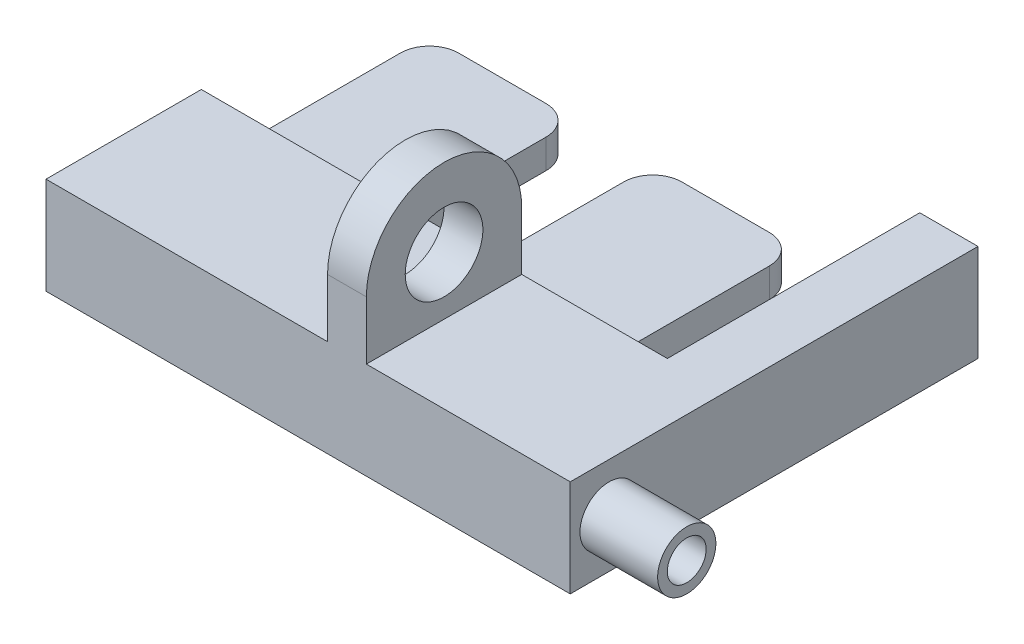
ISO-10303-21;
HEADER;
FILE_DESCRIPTION(('STEP AP214'),'2;1');
FILE_NAME('part.step','',(''),(''),'','','');
FILE_SCHEMA(('AUTOMOTIVE_DESIGN { 1 0 10303 214 1 1 1 1 }'));
ENDSEC;
DATA;
#1=APPLICATION_CONTEXT('core data for automotive mechanical design processes');
#2=APPLICATION_PROTOCOL_DEFINITION('international standard','automotive_design',2000,#1);
#3=PRODUCT_CONTEXT('',#1,'mechanical');
#4=PRODUCT('Part','Part','',(#3));
#5=PRODUCT_RELATED_PRODUCT_CATEGORY('part','',(#4));
#6=PRODUCT_DEFINITION_FORMATION('','',#4);
#7=PRODUCT_DEFINITION_CONTEXT('part definition',#1,'design');
#8=PRODUCT_DEFINITION('design','',#6,#7);
#9=PRODUCT_DEFINITION_SHAPE('','',#8);
#10=(LENGTH_UNIT() NAMED_UNIT(*) SI_UNIT(.MILLI.,.METRE.));
#11=(NAMED_UNIT(*) PLANE_ANGLE_UNIT() SI_UNIT($,.RADIAN.));
#12=(NAMED_UNIT(*) SI_UNIT($,.STERADIAN.) SOLID_ANGLE_UNIT());
#13=UNCERTAINTY_MEASURE_WITH_UNIT(LENGTH_MEASURE(1.E-05),#10,'distance_accuracy_value','');
#14=(GEOMETRIC_REPRESENTATION_CONTEXT(3) GLOBAL_UNCERTAINTY_ASSIGNED_CONTEXT((#13)) GLOBAL_UNIT_ASSIGNED_CONTEXT((#10,
#11,#12)) REPRESENTATION_CONTEXT('',''));
#15=CARTESIAN_POINT('',(0.,0.,0.));
#16=DIRECTION('',(0.,0.,1.));
#17=DIRECTION('',(1.,0.,0.));
#18=AXIS2_PLACEMENT_3D('',#15,#16,#17);
#19=CARTESIAN_POINT('',(0.,0.,0.));
#20=DIRECTION('',(0.,0.,1.));
#21=DIRECTION('',(1.,0.,0.));
#22=AXIS2_PLACEMENT_3D('',#19,#20,#21);
#23=PLANE('',#22);
#24=DIRECTION('',(0.,-1.,0.));
#25=VECTOR('',#24,1.);
#26=CARTESIAN_POINT('',(7.25,-0.750000000000003,0.));
#27=LINE('',#26,#25);
#28=CARTESIAN_POINT('',(7.25,0.749999999999998,0.));
#29=VERTEX_POINT('',#28);
#30=CARTESIAN_POINT('',(7.25,-0.750000000000003,0.));
#31=VERTEX_POINT('',#30);
#32=EDGE_CURVE('E222',#29,#31,#27,.T.);
#33=ORIENTED_EDGE('',*,*,#32,.F.);
#34=DIRECTION('',(1.,0.,0.));
#35=VECTOR('',#34,1.);
#36=CARTESIAN_POINT('',(-0.250000000000003,0.749999999999998,0.));
#37=LINE('',#36,#35);
#38=CARTESIAN_POINT('',(-0.250000000000003,0.749999999999998,0.));
#39=VERTEX_POINT('',#38);
#40=EDGE_CURVE('E227',#39,#29,#37,.T.);
#41=ORIENTED_EDGE('',*,*,#40,.F.);
#42=DIRECTION('',(0.,1.,0.));
#43=VECTOR('',#42,1.);
#44=CARTESIAN_POINT('',(-0.250000000000003,-0.750000000000002,0.));
#45=LINE('',#44,#43);
#46=CARTESIAN_POINT('',(-0.250000000000003,-0.750000000000002,0.));
#47=VERTEX_POINT('',#46);
#48=EDGE_CURVE('E236',#47,#39,#45,.T.);
#49=ORIENTED_EDGE('',*,*,#48,.F.);
#50=DIRECTION('',(-1.,0.,0.));
#51=VECTOR('',#50,1.);
#52=CARTESIAN_POINT('',(-0.250000000000003,-0.750000000000002,0.));
#53=LINE('',#52,#51);
#54=EDGE_CURVE('E233',#31,#47,#53,.T.);
#55=ORIENTED_EDGE('',*,*,#54,.F.);
#56=EDGE_LOOP('',(#33,#41,#49,#55));
#57=FACE_BOUND('',#56,.T.);
#58=DIRECTION('',(0.,1.,0.));
#59=VECTOR('',#58,1.);
#60=CARTESIAN_POINT('',(10.5,2.5,0.));
#61=LINE('',#60,#59);
#62=CARTESIAN_POINT('',(10.5,-2.5,0.));
#63=VERTEX_POINT('',#62);
#64=CARTESIAN_POINT('',(10.5,2.5,0.));
#65=VERTEX_POINT('',#64);
#66=EDGE_CURVE('E312',#63,#65,#61,.T.);
#67=ORIENTED_EDGE('',*,*,#66,.F.);
#68=DIRECTION('',(1.,0.,0.));
#69=VECTOR('',#68,1.);
#70=CARTESIAN_POINT('',(13.5,-2.5,0.));
#71=LINE('',#70,#69);
#72=CARTESIAN_POINT('',(-13.5,-2.5,0.));
#73=VERTEX_POINT('',#72);
#74=EDGE_CURVE('E334',#73,#63,#71,.T.);
#75=ORIENTED_EDGE('',*,*,#74,.F.);
#76=DIRECTION('',(0.,-1.,0.));
#77=VECTOR('',#76,1.);
#78=CARTESIAN_POINT('',(-13.5,-2.5,0.));
#79=LINE('',#78,#77);
#80=CARTESIAN_POINT('',(-13.5,2.5,0.));
#81=VERTEX_POINT('',#80);
#82=EDGE_CURVE('E344',#81,#73,#79,.T.);
#83=ORIENTED_EDGE('',*,*,#82,.F.);
#84=DIRECTION('',(-1.,0.,0.));
#85=VECTOR('',#84,1.);
#86=CARTESIAN_POINT('',(13.5,2.5,0.));
#87=LINE('',#86,#85);
#88=CARTESIAN_POINT('',(1.,2.5,0.));
#89=VERTEX_POINT('',#88);
#90=EDGE_CURVE('E352',#89,#81,#87,.T.);
#91=ORIENTED_EDGE('',*,*,#90,.F.);
#92=DIRECTION('',(0.,-1.,0.));
#93=VECTOR('',#92,1.);
#94=CARTESIAN_POINT('',(1.,2.5,0.));
#95=LINE('',#94,#93);
#96=CARTESIAN_POINT('',(1.,5.5,0.));
#97=VERTEX_POINT('',#96);
#98=EDGE_CURVE('E281',#97,#89,#95,.T.);
#99=ORIENTED_EDGE('',*,*,#98,.F.);
#100=DIRECTION('',(-1.,0.,0.));
#101=VECTOR('',#100,1.);
#102=CARTESIAN_POINT('',(3.,5.5,0.));
#103=LINE('',#102,#101);
#104=CARTESIAN_POINT('',(3.,5.5,0.));
#105=VERTEX_POINT('',#104);
#106=EDGE_CURVE('E290',#105,#97,#103,.T.);
#107=ORIENTED_EDGE('',*,*,#106,.F.);
#108=DIRECTION('',(0.,-1.,0.));
#109=VECTOR('',#108,1.);
#110=CARTESIAN_POINT('',(3.,2.5,0.));
#111=LINE('',#110,#109);
#112=CARTESIAN_POINT('',(3.,2.5,0.));
#113=VERTEX_POINT('',#112);
#114=EDGE_CURVE('E258',#105,#113,#111,.T.);
#115=ORIENTED_EDGE('',*,*,#114,.T.);
#116=EDGE_CURVE('E354',#65,#113,#87,.T.);
#117=ORIENTED_EDGE('',*,*,#116,.F.);
#118=EDGE_LOOP('',(#67,#75,#83,#91,#99,#107,#115,#117));
#119=FACE_BOUND('',#118,.T.);
#120=DIRECTION('',(0.,-1.,0.));
#121=VECTOR('',#120,1.);
#122=CARTESIAN_POINT('',(-4.25,-0.750000000000001,0.));
#123=LINE('',#122,#121);
#124=CARTESIAN_POINT('',(-4.25,0.749999999999999,0.));
#125=VERTEX_POINT('',#124);
#126=CARTESIAN_POINT('',(-4.25,-0.750000000000001,0.));
#127=VERTEX_POINT('',#126);
#128=EDGE_CURVE('E188',#125,#127,#123,.T.);
#129=ORIENTED_EDGE('',*,*,#128,.F.);
#130=DIRECTION('',(1.,0.,0.));
#131=VECTOR('',#130,1.);
#132=CARTESIAN_POINT('',(-11.75,0.75,0.));
#133=LINE('',#132,#131);
#134=CARTESIAN_POINT('',(-11.75,0.75,0.));
#135=VERTEX_POINT('',#134);
#136=EDGE_CURVE('E201',#135,#125,#133,.T.);
#137=ORIENTED_EDGE('',*,*,#136,.F.);
#138=DIRECTION('',(0.,1.,0.));
#139=VECTOR('',#138,1.);
#140=CARTESIAN_POINT('',(-11.75,-0.75,0.));
#141=LINE('',#140,#139);
#142=CARTESIAN_POINT('',(-11.75,-0.75,0.));
#143=VERTEX_POINT('',#142);
#144=EDGE_CURVE('E210',#143,#135,#141,.T.);
#145=ORIENTED_EDGE('',*,*,#144,.F.);
#146=DIRECTION('',(-1.,0.,0.));
#147=VECTOR('',#146,1.);
#148=CARTESIAN_POINT('',(-11.75,-0.75,0.));
#149=LINE('',#148,#147);
#150=EDGE_CURVE('E204',#127,#143,#149,.T.);
#151=ORIENTED_EDGE('',*,*,#150,.F.);
#152=EDGE_LOOP('',(#129,#137,#145,#151));
#153=FACE_BOUND('',#152,.T.);
#154=ADVANCED_FACE('F35',(#57,#119,#153),#23,.F.);
#155=CARTESIAN_POINT('',(13.5,2.5,8.));
#156=DIRECTION('',(0.,-1.,0.));
#157=DIRECTION('',(1.,0.,0.));
#158=AXIS2_PLACEMENT_3D('',#155,#156,#157);
#159=PLANE('',#158);
#160=DIRECTION('',(0.,0.,1.));
#161=VECTOR('',#160,1.);
#162=CARTESIAN_POINT('',(1.,2.5,8.));
#163=LINE('',#162,#161);
#164=CARTESIAN_POINT('',(1.,2.5,8.));
#165=VERTEX_POINT('',#164);
#166=EDGE_CURVE('E275',#89,#165,#163,.T.);
#167=ORIENTED_EDGE('',*,*,#166,.F.);
#168=ORIENTED_EDGE('',*,*,#90,.T.);
#169=DIRECTION('',(0.,0.,-1.));
#170=VECTOR('',#169,1.);
#171=CARTESIAN_POINT('',(-13.5,2.5,8.));
#172=LINE('',#171,#170);
#173=CARTESIAN_POINT('',(-13.5,2.5,8.));
#174=VERTEX_POINT('',#173);
#175=EDGE_CURVE('E360',#174,#81,#172,.T.);
#176=ORIENTED_EDGE('',*,*,#175,.F.);
#177=DIRECTION('',(-1.,0.,0.));
#178=VECTOR('',#177,1.);
#179=CARTESIAN_POINT('',(13.5,2.5,8.));
#180=LINE('',#179,#178);
#181=EDGE_CURVE('E270',#165,#174,#180,.T.);
#182=ORIENTED_EDGE('',*,*,#181,.F.);
#183=EDGE_LOOP('',(#167,#168,#176,#182));
#184=FACE_BOUND('',#183,.T.);
#185=ADVANCED_FACE('F425',(#184),#159,.F.);
#186=CARTESIAN_POINT('',(13.5,-2.5,8.));
#187=DIRECTION('',(-1.,0.,0.));
#188=DIRECTION('',(0.,0.,1.));
#189=AXIS2_PLACEMENT_3D('',#186,#187,#188);
#190=PLANE('',#189);
#191=DIRECTION('',(0.,0.,-1.));
#192=VECTOR('',#191,1.);
#193=CARTESIAN_POINT('',(13.5,-2.5,8.));
#194=LINE('',#193,#192);
#195=CARTESIAN_POINT('',(13.5,-2.5,8.));
#196=VERTEX_POINT('',#195);
#197=CARTESIAN_POINT('',(13.5,-2.5,-13.));
#198=VERTEX_POINT('',#197);
#199=EDGE_CURVE('E367',#196,#198,#194,.T.);
#200=ORIENTED_EDGE('',*,*,#199,.T.);
#201=DIRECTION('',(0.,-1.,0.));
#202=VECTOR('',#201,1.);
#203=CARTESIAN_POINT('',(13.5,2.5,-13.));
#204=LINE('',#203,#202);
#205=CARTESIAN_POINT('',(13.5,2.5,-13.));
#206=VERTEX_POINT('',#205);
#207=EDGE_CURVE('E315',#206,#198,#204,.T.);
#208=ORIENTED_EDGE('',*,*,#207,.F.);
#209=DIRECTION('',(0.,0.,-1.));
#210=VECTOR('',#209,1.);
#211=CARTESIAN_POINT('',(13.5,2.5,8.));
#212=LINE('',#211,#210);
#213=CARTESIAN_POINT('',(13.5,2.5,8.));
#214=VERTEX_POINT('',#213);
#215=EDGE_CURVE('E368',#214,#206,#212,.T.);
#216=ORIENTED_EDGE('',*,*,#215,.F.);
#217=DIRECTION('',(0.,1.,0.));
#218=VECTOR('',#217,1.);
#219=CARTESIAN_POINT('',(13.5,-2.5,8.));
#220=LINE('',#219,#218);
#221=EDGE_CURVE('E381',#196,#214,#220,.T.);
#222=ORIENTED_EDGE('',*,*,#221,.F.);
#223=EDGE_LOOP('',(#200,#208,#216,#222));
#224=FACE_BOUND('',#223,.T.);
#225=CARTESIAN_POINT('',(13.5,0.,6.));
#226=DIRECTION('',(-1.,0.,0.));
#227=DIRECTION('',(0.,0.,1.));
#228=AXIS2_PLACEMENT_3D('',#225,#226,#227);
#229=CIRCLE('',#228,1.5);
#230=CARTESIAN_POINT('',(13.5,0.,7.5));
#231=VERTEX_POINT('',#230);
#232=EDGE_CURVE('E347',#231,#231,#229,.F.);
#233=ORIENTED_EDGE('',*,*,#232,.F.);
#234=EDGE_LOOP('',(#233));
#235=FACE_BOUND('',#234,.T.);
#236=ADVANCED_FACE('F405',(#224,#235),#190,.F.);
#237=CARTESIAN_POINT('',(-13.5,-2.5,8.));
#238=DIRECTION('',(1.,0.,0.));
#239=DIRECTION('',(0.,0.,-1.));
#240=AXIS2_PLACEMENT_3D('',#237,#238,#239);
#241=PLANE('',#240);
#242=ORIENTED_EDGE('',*,*,#82,.T.);
#243=DIRECTION('',(0.,0.,-1.));
#244=VECTOR('',#243,1.);
#245=CARTESIAN_POINT('',(-13.5,-2.5,8.));
#246=LINE('',#245,#244);
#247=CARTESIAN_POINT('',(-13.5,-2.5,8.));
#248=VERTEX_POINT('',#247);
#249=EDGE_CURVE('E351',#248,#73,#246,.T.);
#250=ORIENTED_EDGE('',*,*,#249,.F.);
#251=DIRECTION('',(0.,-1.,0.));
#252=VECTOR('',#251,1.);
#253=CARTESIAN_POINT('',(-13.5,-2.5,8.));
#254=LINE('',#253,#252);
#255=EDGE_CURVE('E328',#174,#248,#254,.T.);
#256=ORIENTED_EDGE('',*,*,#255,.F.);
#257=ORIENTED_EDGE('',*,*,#175,.T.);
#258=EDGE_LOOP('',(#242,#250,#256,#257));
#259=FACE_BOUND('',#258,.T.);
#260=ADVANCED_FACE('F426',(#259),#241,.F.);
#261=CARTESIAN_POINT('',(13.5,-2.5,8.));
#262=DIRECTION('',(0.,1.,0.));
#263=DIRECTION('',(-1.,0.,0.));
#264=AXIS2_PLACEMENT_3D('',#261,#262,#263);
#265=PLANE('',#264);
#266=ORIENTED_EDGE('',*,*,#74,.T.);
#267=DIRECTION('',(0.,0.,1.));
#268=VECTOR('',#267,1.);
#269=CARTESIAN_POINT('',(10.5,-2.5,-13.));
#270=LINE('',#269,#268);
#271=CARTESIAN_POINT('',(10.5,-2.5,-13.));
#272=VERTEX_POINT('',#271);
#273=EDGE_CURVE('E339',#272,#63,#270,.T.);
#274=ORIENTED_EDGE('',*,*,#273,.F.);
#275=DIRECTION('',(-1.,0.,0.));
#276=VECTOR('',#275,1.);
#277=CARTESIAN_POINT('',(13.5,-2.5,-13.));
#278=LINE('',#277,#276);
#279=EDGE_CURVE('E318',#198,#272,#278,.T.);
#280=ORIENTED_EDGE('',*,*,#279,.F.);
#281=ORIENTED_EDGE('',*,*,#199,.F.);
#282=DIRECTION('',(1.,0.,0.));
#283=VECTOR('',#282,1.);
#284=CARTESIAN_POINT('',(13.5,-2.5,8.));
#285=LINE('',#284,#283);
#286=EDGE_CURVE('E384',#248,#196,#285,.T.);
#287=ORIENTED_EDGE('',*,*,#286,.F.);
#288=ORIENTED_EDGE('',*,*,#249,.T.);
#289=EDGE_LOOP('',(#266,#274,#280,#281,#287,#288));
#290=FACE_BOUND('',#289,.T.);
#291=ADVANCED_FACE('F393',(#290),#265,.F.);
#292=ORIENTED_EDGE('',*,*,#116,.T.);
#293=DIRECTION('',(0.,0.,1.));
#294=VECTOR('',#293,1.);
#295=CARTESIAN_POINT('',(3.,2.5,8.));
#296=LINE('',#295,#294);
#297=CARTESIAN_POINT('',(3.,2.5,8.));
#298=VERTEX_POINT('',#297);
#299=EDGE_CURVE('E265',#113,#298,#296,.T.);
#300=ORIENTED_EDGE('',*,*,#299,.T.);
#301=EDGE_CURVE('E355',#214,#298,#180,.T.);
#302=ORIENTED_EDGE('',*,*,#301,.F.);
#303=ORIENTED_EDGE('',*,*,#215,.T.);
#304=DIRECTION('',(1.,0.,0.));
#305=VECTOR('',#304,1.);
#306=CARTESIAN_POINT('',(13.5,2.5,-13.));
#307=LINE('',#306,#305);
#308=CARTESIAN_POINT('',(10.5,2.5,-13.));
#309=VERTEX_POINT('',#308);
#310=EDGE_CURVE('E322',#309,#206,#307,.T.);
#311=ORIENTED_EDGE('',*,*,#310,.F.);
#312=DIRECTION('',(0.,0.,1.));
#313=VECTOR('',#312,1.);
#314=CARTESIAN_POINT('',(10.5,2.5,-13.));
#315=LINE('',#314,#313);
#316=EDGE_CURVE('E325',#309,#65,#315,.T.);
#317=ORIENTED_EDGE('',*,*,#316,.T.);
#318=EDGE_LOOP('',(#292,#300,#302,#303,#311,#317));
#319=FACE_BOUND('',#318,.T.);
#320=ADVANCED_FACE('F407',(#319),#159,.F.);
#321=CARTESIAN_POINT('',(0.,0.,8.));
#322=DIRECTION('',(0.,0.,1.));
#323=DIRECTION('',(1.,0.,0.));
#324=AXIS2_PLACEMENT_3D('',#321,#322,#323);
#325=PLANE('',#324);
#326=ORIENTED_EDGE('',*,*,#255,.T.);
#327=ORIENTED_EDGE('',*,*,#286,.T.);
#328=ORIENTED_EDGE('',*,*,#221,.T.);
#329=ORIENTED_EDGE('',*,*,#301,.T.);
#330=DIRECTION('',(0.,1.,0.));
#331=VECTOR('',#330,1.);
#332=CARTESIAN_POINT('',(3.,2.5,8.));
#333=LINE('',#332,#331);
#334=CARTESIAN_POINT('',(3.,5.5,8.));
#335=VERTEX_POINT('',#334);
#336=EDGE_CURVE('E259',#298,#335,#333,.T.);
#337=ORIENTED_EDGE('',*,*,#336,.T.);
#338=DIRECTION('',(-1.,0.,0.));
#339=VECTOR('',#338,1.);
#340=CARTESIAN_POINT('',(3.,5.5,8.));
#341=LINE('',#340,#339);
#342=CARTESIAN_POINT('',(1.,5.5,8.));
#343=VERTEX_POINT('',#342);
#344=EDGE_CURVE('E269',#335,#343,#341,.T.);
#345=ORIENTED_EDGE('',*,*,#344,.T.);
#346=DIRECTION('',(0.,1.,0.));
#347=VECTOR('',#346,1.);
#348=CARTESIAN_POINT('',(1.,2.5,8.));
#349=LINE('',#348,#347);
#350=EDGE_CURVE('E252',#165,#343,#349,.T.);
#351=ORIENTED_EDGE('',*,*,#350,.F.);
#352=ORIENTED_EDGE('',*,*,#181,.T.);
#353=EDGE_LOOP('',(#326,#327,#328,#329,#337,#345,#351,#352));
#354=FACE_BOUND('',#353,.T.);
#355=ADVANCED_FACE('F413',(#354),#325,.T.);
#356=CARTESIAN_POINT('',(10.5,2.5,-13.));
#357=DIRECTION('',(1.,0.,0.));
#358=DIRECTION('',(0.,0.,-1.));
#359=AXIS2_PLACEMENT_3D('',#356,#357,#358);
#360=PLANE('',#359);
#361=ORIENTED_EDGE('',*,*,#66,.T.);
#362=ORIENTED_EDGE('',*,*,#316,.F.);
#363=DIRECTION('',(0.,1.,0.));
#364=VECTOR('',#363,1.);
#365=CARTESIAN_POINT('',(10.5,2.5,-13.));
#366=LINE('',#365,#364);
#367=EDGE_CURVE('E320',#272,#309,#366,.T.);
#368=ORIENTED_EDGE('',*,*,#367,.F.);
#369=ORIENTED_EDGE('',*,*,#273,.T.);
#370=EDGE_LOOP('',(#361,#362,#368,#369));
#371=FACE_BOUND('',#370,.T.);
#372=ADVANCED_FACE('F398',(#371),#360,.F.);
#373=CARTESIAN_POINT('',(0.,0.,-13.));
#374=DIRECTION('',(0.,0.,-1.));
#375=DIRECTION('',(-1.,0.,0.));
#376=AXIS2_PLACEMENT_3D('',#373,#374,#375);
#377=PLANE('',#376);
#378=CARTESIAN_POINT('',(12.,-1.3,-13.));
#379=DIRECTION('',(0.,0.,-1.));
#380=DIRECTION('',(1.,0.,0.));
#381=AXIS2_PLACEMENT_3D('',#378,#379,#380);
#382=CIRCLE('',#381,0.500000000000001);
#383=CARTESIAN_POINT('',(12.5,-1.3,-13.));
#384=VERTEX_POINT('',#383);
#385=EDGE_CURVE('E302',#384,#384,#382,.T.);
#386=ORIENTED_EDGE('',*,*,#385,.F.);
#387=EDGE_LOOP('',(#386));
#388=FACE_BOUND('',#387,.T.);
#389=CARTESIAN_POINT('',(12.,1.3,-13.));
#390=DIRECTION('',(0.,0.,-1.));
#391=DIRECTION('',(-1.,0.,0.));
#392=AXIS2_PLACEMENT_3D('',#389,#390,#391);
#393=CIRCLE('',#392,0.500000000000001);
#394=CARTESIAN_POINT('',(11.5,1.3,-13.));
#395=VERTEX_POINT('',#394);
#396=EDGE_CURVE('E306',#395,#395,#393,.T.);
#397=ORIENTED_EDGE('',*,*,#396,.F.);
#398=EDGE_LOOP('',(#397));
#399=FACE_BOUND('',#398,.T.);
#400=ORIENTED_EDGE('',*,*,#207,.T.);
#401=ORIENTED_EDGE('',*,*,#279,.T.);
#402=ORIENTED_EDGE('',*,*,#367,.T.);
#403=ORIENTED_EDGE('',*,*,#310,.T.);
#404=EDGE_LOOP('',(#400,#401,#402,#403));
#405=FACE_BOUND('',#404,.T.);
#406=ADVANCED_FACE('F401',(#388,#399,#405),#377,.T.);
#407=CARTESIAN_POINT('',(12.,1.3,-10.));
#408=DIRECTION('',(0.,0.,-1.));
#409=DIRECTION('',(-1.,0.,0.));
#410=AXIS2_PLACEMENT_3D('',#407,#408,#409);
#411=CYLINDRICAL_SURFACE('',#410,0.500000000000001);
#412=CARTESIAN_POINT('',(12.,1.3,-10.));
#413=DIRECTION('',(0.,0.,-1.));
#414=DIRECTION('',(-1.,0.,0.));
#415=AXIS2_PLACEMENT_3D('',#412,#413,#414);
#416=CIRCLE('',#415,0.500000000000001);
#417=CARTESIAN_POINT('',(11.5,1.3,-10.));
#418=VERTEX_POINT('',#417);
#419=EDGE_CURVE('E309',#418,#418,#416,.T.);
#420=ORIENTED_EDGE('',*,*,#419,.F.);
#421=EDGE_LOOP('',(#420));
#422=FACE_BOUND('',#421,.T.);
#423=ORIENTED_EDGE('',*,*,#396,.T.);
#424=EDGE_LOOP('',(#423));
#425=FACE_BOUND('',#424,.T.);
#426=ADVANCED_FACE('F483',(#422,#425),#411,.F.);
#427=CARTESIAN_POINT('',(12.,1.3,-10.));
#428=DIRECTION('',(0.,0.,-1.));
#429=DIRECTION('',(-1.,0.,0.));
#430=AXIS2_PLACEMENT_3D('',#427,#428,#429);
#431=PLANE('',#430);
#432=ORIENTED_EDGE('',*,*,#419,.T.);
#433=EDGE_LOOP('',(#432));
#434=FACE_BOUND('',#433,.T.);
#435=ADVANCED_FACE('F479',(#434),#431,.T.);
#436=CARTESIAN_POINT('',(12.,-1.3,-10.));
#437=DIRECTION('',(0.,0.,-1.));
#438=DIRECTION('',(-1.,0.,0.));
#439=AXIS2_PLACEMENT_3D('',#436,#437,#438);
#440=CYLINDRICAL_SURFACE('',#439,0.500000000000001);
#441=CARTESIAN_POINT('',(12.,-1.3,-10.));
#442=DIRECTION('',(0.,0.,-1.));
#443=DIRECTION('',(1.,0.,0.));
#444=AXIS2_PLACEMENT_3D('',#441,#442,#443);
#445=CIRCLE('',#444,0.500000000000001);
#446=CARTESIAN_POINT('',(12.5,-1.3,-10.));
#447=VERTEX_POINT('',#446);
#448=EDGE_CURVE('E303',#447,#447,#445,.T.);
#449=ORIENTED_EDGE('',*,*,#448,.F.);
#450=EDGE_LOOP('',(#449));
#451=FACE_BOUND('',#450,.T.);
#452=ORIENTED_EDGE('',*,*,#385,.T.);
#453=EDGE_LOOP('',(#452));
#454=FACE_BOUND('',#453,.T.);
#455=ADVANCED_FACE('F475',(#451,#454),#440,.F.);
#456=CARTESIAN_POINT('',(12.,-1.3,-10.));
#457=DIRECTION('',(0.,0.,1.));
#458=DIRECTION('',(1.,0.,0.));
#459=AXIS2_PLACEMENT_3D('',#456,#457,#458);
#460=PLANE('',#459);
#461=ORIENTED_EDGE('',*,*,#448,.T.);
#462=EDGE_LOOP('',(#461));
#463=FACE_BOUND('',#462,.T.);
#464=ADVANCED_FACE('F470',(#463),#460,.F.);
#465=CARTESIAN_POINT('',(17.5,0.,6.));
#466=DIRECTION('',(1.,0.,0.));
#467=DIRECTION('',(0.,0.,-1.));
#468=AXIS2_PLACEMENT_3D('',#465,#466,#467);
#469=PLANE('',#468);
#470=CARTESIAN_POINT('',(17.5,0.,6.));
#471=DIRECTION('',(1.,0.,0.));
#472=DIRECTION('',(0.,0.,-1.));
#473=AXIS2_PLACEMENT_3D('',#470,#471,#472);
#474=CIRCLE('',#473,1.5);
#475=CARTESIAN_POINT('',(17.5,0.,4.5));
#476=VERTEX_POINT('',#475);
#477=EDGE_CURVE('E297',#476,#476,#474,.T.);
#478=ORIENTED_EDGE('',*,*,#477,.T.);
#479=EDGE_LOOP('',(#478));
#480=FACE_BOUND('',#479,.T.);
#481=CARTESIAN_POINT('',(17.5,0.,6.));
#482=DIRECTION('',(1.,0.,0.));
#483=DIRECTION('',(0.,0.,-1.));
#484=AXIS2_PLACEMENT_3D('',#481,#482,#483);
#485=CIRCLE('',#484,1.);
#486=CARTESIAN_POINT('',(17.5,0.,5.));
#487=VERTEX_POINT('',#486);
#488=EDGE_CURVE('E294',#487,#487,#485,.T.);
#489=ORIENTED_EDGE('',*,*,#488,.F.);
#490=EDGE_LOOP('',(#489));
#491=FACE_BOUND('',#490,.T.);
#492=ADVANCED_FACE('F464',(#480,#491),#469,.T.);
#493=CARTESIAN_POINT('',(17.5,0.,6.));
#494=DIRECTION('',(-1.,0.,0.));
#495=DIRECTION('',(0.,0.,1.));
#496=AXIS2_PLACEMENT_3D('',#493,#494,#495);
#497=CYLINDRICAL_SURFACE('',#496,1.5);
#498=ORIENTED_EDGE('',*,*,#477,.F.);
#499=EDGE_LOOP('',(#498));
#500=FACE_BOUND('',#499,.T.);
#501=ORIENTED_EDGE('',*,*,#232,.T.);
#502=EDGE_LOOP('',(#501));
#503=FACE_BOUND('',#502,.T.);
#504=ADVANCED_FACE('F456',(#500,#503),#497,.T.);
#505=CARTESIAN_POINT('',(17.5,0.,6.));
#506=DIRECTION('',(-1.,0.,0.));
#507=DIRECTION('',(0.,0.,1.));
#508=AXIS2_PLACEMENT_3D('',#505,#506,#507);
#509=CYLINDRICAL_SURFACE('',#508,1.);
#510=ORIENTED_EDGE('',*,*,#488,.T.);
#511=EDGE_LOOP('',(#510));
#512=FACE_BOUND('',#511,.T.);
#513=CARTESIAN_POINT('',(13.5,0.,6.));
#514=DIRECTION('',(1.,0.,0.));
#515=DIRECTION('',(0.,0.,-1.));
#516=AXIS2_PLACEMENT_3D('',#513,#514,#515);
#517=CIRCLE('',#516,1.);
#518=CARTESIAN_POINT('',(13.5,0.,5.));
#519=VERTEX_POINT('',#518);
#520=EDGE_CURVE('E292',#519,#519,#517,.T.);
#521=ORIENTED_EDGE('',*,*,#520,.F.);
#522=EDGE_LOOP('',(#521));
#523=FACE_BOUND('',#522,.T.);
#524=ADVANCED_FACE('F449',(#512,#523),#509,.F.);
#525=ORIENTED_EDGE('',*,*,#520,.T.);
#526=EDGE_LOOP('',(#525));
#527=FACE_BOUND('',#526,.T.);
#528=ADVANCED_FACE('F435',(#527),#190,.F.);
#529=CARTESIAN_POINT('',(3.,5.5,4.));
#530=DIRECTION('',(-1.,0.,0.));
#531=DIRECTION('',(0.,0.,1.));
#532=AXIS2_PLACEMENT_3D('',#529,#530,#531);
#533=CYLINDRICAL_SURFACE('',#532,4.);
#534=CARTESIAN_POINT('',(1.,5.5,4.));
#535=DIRECTION('',(-1.,0.,0.));
#536=DIRECTION('',(0.,0.,-1.));
#537=AXIS2_PLACEMENT_3D('',#534,#535,#536);
#538=CIRCLE('',#537,4.);
#539=EDGE_CURVE('E262',#343,#97,#538,.T.);
#540=ORIENTED_EDGE('',*,*,#539,.F.);
#541=ORIENTED_EDGE('',*,*,#344,.F.);
#542=CARTESIAN_POINT('',(3.,5.5,4.));
#543=DIRECTION('',(-1.,0.,0.));
#544=DIRECTION('',(0.,0.,-1.));
#545=AXIS2_PLACEMENT_3D('',#542,#543,#544);
#546=CIRCLE('',#545,4.);
#547=EDGE_CURVE('E255',#335,#105,#546,.T.);
#548=ORIENTED_EDGE('',*,*,#547,.T.);
#549=ORIENTED_EDGE('',*,*,#106,.T.);
#550=EDGE_LOOP('',(#540,#541,#548,#549));
#551=FACE_BOUND('',#550,.T.);
#552=ADVANCED_FACE('F418',(#551),#533,.T.);
#553=CARTESIAN_POINT('',(3.,5.5,4.));
#554=DIRECTION('',(1.,0.,0.));
#555=DIRECTION('',(0.,0.,-1.));
#556=AXIS2_PLACEMENT_3D('',#553,#554,#555);
#557=PLANE('',#556);
#558=CARTESIAN_POINT('',(3.,5.5,4.));
#559=DIRECTION('',(-1.,0.,0.));
#560=DIRECTION('',(0.,0.,1.));
#561=AXIS2_PLACEMENT_3D('',#558,#559,#560);
#562=CIRCLE('',#561,2.);
#563=CARTESIAN_POINT('',(3.,5.5,6.));
#564=VERTEX_POINT('',#563);
#565=EDGE_CURVE('E249',#564,#564,#562,.T.);
#566=ORIENTED_EDGE('',*,*,#565,.T.);
#567=EDGE_LOOP('',(#566));
#568=FACE_BOUND('',#567,.T.);
#569=ORIENTED_EDGE('',*,*,#336,.F.);
#570=ORIENTED_EDGE('',*,*,#299,.F.);
#571=ORIENTED_EDGE('',*,*,#114,.F.);
#572=ORIENTED_EDGE('',*,*,#547,.F.);
#573=EDGE_LOOP('',(#569,#570,#571,#572));
#574=FACE_BOUND('',#573,.T.);
#575=ADVANCED_FACE('F411',(#568,#574),#557,.T.);
#576=CARTESIAN_POINT('',(1.,5.5,4.));
#577=DIRECTION('',(1.,0.,0.));
#578=DIRECTION('',(0.,0.,-1.));
#579=AXIS2_PLACEMENT_3D('',#576,#577,#578);
#580=PLANE('',#579);
#581=CARTESIAN_POINT('',(1.,5.5,4.));
#582=DIRECTION('',(-1.,0.,0.));
#583=DIRECTION('',(0.,0.,1.));
#584=AXIS2_PLACEMENT_3D('',#581,#582,#583);
#585=CIRCLE('',#584,2.);
#586=CARTESIAN_POINT('',(1.,5.5,6.));
#587=VERTEX_POINT('',#586);
#588=EDGE_CURVE('E248',#587,#587,#585,.T.);
#589=ORIENTED_EDGE('',*,*,#588,.F.);
#590=EDGE_LOOP('',(#589));
#591=FACE_BOUND('',#590,.T.);
#592=ORIENTED_EDGE('',*,*,#350,.T.);
#593=ORIENTED_EDGE('',*,*,#539,.T.);
#594=ORIENTED_EDGE('',*,*,#98,.T.);
#595=ORIENTED_EDGE('',*,*,#166,.T.);
#596=EDGE_LOOP('',(#592,#593,#594,#595));
#597=FACE_BOUND('',#596,.T.);
#598=ADVANCED_FACE('F421',(#591,#597),#580,.F.);
#599=CARTESIAN_POINT('',(3.,5.5,4.));
#600=DIRECTION('',(-1.,0.,0.));
#601=DIRECTION('',(0.,0.,1.));
#602=AXIS2_PLACEMENT_3D('',#599,#600,#601);
#603=CYLINDRICAL_SURFACE('',#602,2.);
#604=ORIENTED_EDGE('',*,*,#565,.F.);
#605=EDGE_LOOP('',(#604));
#606=FACE_BOUND('',#605,.T.);
#607=ORIENTED_EDGE('',*,*,#588,.T.);
#608=EDGE_LOOP('',(#607));
#609=FACE_BOUND('',#608,.T.);
#610=ADVANCED_FACE('F607',(#606,#609),#603,.F.);
#611=CARTESIAN_POINT('',(7.25,-0.750000000000003,-10.));
#612=DIRECTION('',(-1.,0.,0.));
#613=DIRECTION('',(0.,0.,1.));
#614=AXIS2_PLACEMENT_3D('',#611,#612,#613);
#615=PLANE('',#614);
#616=DIRECTION('',(0.,0.,1.));
#617=VECTOR('',#616,1.);
#618=CARTESIAN_POINT('',(7.25,-0.750000000000003,-10.));
#619=LINE('',#618,#617);
#620=CARTESIAN_POINT('',(7.25,-0.750000000000003,-8.5));
#621=VERTEX_POINT('',#620);
#622=EDGE_CURVE('E246',#621,#31,#619,.T.);
#623=ORIENTED_EDGE('',*,*,#622,.F.);
#624=DIRECTION('',(0.,-1.,0.));
#625=VECTOR('',#624,1.);
#626=CARTESIAN_POINT('',(7.25,0.749999999999998,-8.5));
#627=LINE('',#626,#625);
#628=CARTESIAN_POINT('',(7.25,0.749999999999998,-8.5));
#629=VERTEX_POINT('',#628);
#630=EDGE_CURVE('E58',#621,#629,#627,.F.);
#631=ORIENTED_EDGE('',*,*,#630,.T.);
#632=DIRECTION('',(0.,0.,1.));
#633=VECTOR('',#632,1.);
#634=CARTESIAN_POINT('',(7.25,0.749999999999998,-10.));
#635=LINE('',#634,#633);
#636=EDGE_CURVE('E230',#629,#29,#635,.T.);
#637=ORIENTED_EDGE('',*,*,#636,.T.);
#638=ORIENTED_EDGE('',*,*,#32,.T.);
#639=EDGE_LOOP('',(#623,#631,#637,#638));
#640=FACE_BOUND('',#639,.T.);
#641=ADVANCED_FACE('F615',(#640),#615,.F.);
#642=CARTESIAN_POINT('',(-0.250000000000003,-0.750000000000002,-10.));
#643=DIRECTION('',(0.,1.,0.));
#644=DIRECTION('',(-1.,0.,0.));
#645=AXIS2_PLACEMENT_3D('',#642,#643,#644);
#646=PLANE('',#645);
#647=DIRECTION('',(-1.,0.,0.));
#648=VECTOR('',#647,1.);
#649=CARTESIAN_POINT('',(-0.250000000000003,-0.750000000000002,-10.));
#650=LINE('',#649,#648);
#651=CARTESIAN_POINT('',(5.74999999999999,-0.750000000000002,-10.));
#652=VERTEX_POINT('',#651);
#653=CARTESIAN_POINT('',(1.25,-0.750000000000002,-10.));
#654=VERTEX_POINT('',#653);
#655=EDGE_CURVE('E223',#652,#654,#650,.T.);
#656=ORIENTED_EDGE('',*,*,#655,.F.);
#657=CARTESIAN_POINT('',(5.75,-0.750000000000002,-8.5));
#658=DIRECTION('',(0.,1.,0.));
#659=DIRECTION('',(-1.,0.,0.));
#660=AXIS2_PLACEMENT_3D('',#657,#658,#659);
#661=CIRCLE('',#660,1.5);
#662=EDGE_CURVE('E766',#652,#621,#661,.F.);
#663=ORIENTED_EDGE('',*,*,#662,.T.);
#664=ORIENTED_EDGE('',*,*,#622,.T.);
#665=ORIENTED_EDGE('',*,*,#54,.T.);
#666=DIRECTION('',(0.,0.,1.));
#667=VECTOR('',#666,1.);
#668=CARTESIAN_POINT('',(-0.250000000000003,-0.750000000000002,-10.));
#669=LINE('',#668,#667);
#670=CARTESIAN_POINT('',(-0.250000000000003,-0.750000000000002,-8.5));
#671=VERTEX_POINT('',#670);
#672=EDGE_CURVE('E244',#671,#47,#669,.T.);
#673=ORIENTED_EDGE('',*,*,#672,.F.);
#674=CARTESIAN_POINT('',(1.25,-0.750000000000002,-8.5));
#675=DIRECTION('',(0.,1.,0.));
#676=DIRECTION('',(-1.,0.,0.));
#677=AXIS2_PLACEMENT_3D('',#674,#675,#676);
#678=CIRCLE('',#677,1.5);
#679=EDGE_CURVE('E761',#671,#654,#678,.F.);
#680=ORIENTED_EDGE('',*,*,#679,.T.);
#681=EDGE_LOOP('',(#656,#663,#664,#665,#673,#680));
#682=FACE_BOUND('',#681,.T.);
#683=ADVANCED_FACE('F631',(#682),#646,.F.);
#684=CARTESIAN_POINT('',(-0.250000000000003,-0.750000000000002,-10.));
#685=DIRECTION('',(1.,0.,0.));
#686=DIRECTION('',(0.,0.,-1.));
#687=AXIS2_PLACEMENT_3D('',#684,#685,#686);
#688=PLANE('',#687);
#689=DIRECTION('',(0.,0.,1.));
#690=VECTOR('',#689,1.);
#691=CARTESIAN_POINT('',(-0.250000000000003,0.749999999999998,-10.));
#692=LINE('',#691,#690);
#693=CARTESIAN_POINT('',(-0.250000000000003,0.749999999999998,-8.5));
#694=VERTEX_POINT('',#693);
#695=EDGE_CURVE('E242',#694,#39,#692,.T.);
#696=ORIENTED_EDGE('',*,*,#695,.F.);
#697=DIRECTION('',(0.,1.,0.));
#698=VECTOR('',#697,1.);
#699=CARTESIAN_POINT('',(-0.250000000000003,-0.750000000000002,-8.5));
#700=LINE('',#699,#698);
#701=EDGE_CURVE('E11',#694,#671,#700,.F.);
#702=ORIENTED_EDGE('',*,*,#701,.T.);
#703=ORIENTED_EDGE('',*,*,#672,.T.);
#704=ORIENTED_EDGE('',*,*,#48,.T.);
#705=EDGE_LOOP('',(#696,#702,#703,#704));
#706=FACE_BOUND('',#705,.T.);
#707=ADVANCED_FACE('F639',(#706),#688,.F.);
#708=CARTESIAN_POINT('',(-0.250000000000003,0.749999999999998,-10.));
#709=DIRECTION('',(0.,-1.,0.));
#710=DIRECTION('',(1.,0.,0.));
#711=AXIS2_PLACEMENT_3D('',#708,#709,#710);
#712=PLANE('',#711);
#713=ORIENTED_EDGE('',*,*,#636,.F.);
#714=CARTESIAN_POINT('',(5.75,0.749999999999998,-8.5));
#715=DIRECTION('',(0.,-1.,0.));
#716=DIRECTION('',(1.,0.,0.));
#717=AXIS2_PLACEMENT_3D('',#714,#715,#716);
#718=CIRCLE('',#717,1.5);
#719=CARTESIAN_POINT('',(5.74999999999999,0.749999999999998,-10.));
#720=VERTEX_POINT('',#719);
#721=EDGE_CURVE('E43',#629,#720,#718,.F.);
#722=ORIENTED_EDGE('',*,*,#721,.T.);
#723=DIRECTION('',(1.,0.,0.));
#724=VECTOR('',#723,1.);
#725=CARTESIAN_POINT('',(-0.250000000000003,0.749999999999998,-10.));
#726=LINE('',#725,#724);
#727=CARTESIAN_POINT('',(1.25,0.749999999999998,-10.));
#728=VERTEX_POINT('',#727);
#729=EDGE_CURVE('E226',#728,#720,#726,.T.);
#730=ORIENTED_EDGE('',*,*,#729,.F.);
#731=CARTESIAN_POINT('',(1.25,0.749999999999998,-8.5));
#732=DIRECTION('',(0.,-1.,0.));
#733=DIRECTION('',(1.,0.,0.));
#734=AXIS2_PLACEMENT_3D('',#731,#732,#733);
#735=CIRCLE('',#734,1.5);
#736=EDGE_CURVE('E50',#728,#694,#735,.F.);
#737=ORIENTED_EDGE('',*,*,#736,.T.);
#738=ORIENTED_EDGE('',*,*,#695,.T.);
#739=ORIENTED_EDGE('',*,*,#40,.T.);
#740=EDGE_LOOP('',(#713,#722,#730,#737,#738,#739));
#741=FACE_BOUND('',#740,.T.);
#742=ADVANCED_FACE('F648',(#741),#712,.F.);
#743=CARTESIAN_POINT('',(0.,0.,-10.));
#744=DIRECTION('',(0.,0.,-1.));
#745=DIRECTION('',(-1.,0.,0.));
#746=AXIS2_PLACEMENT_3D('',#743,#744,#745);
#747=PLANE('',#746);
#748=ORIENTED_EDGE('',*,*,#729,.T.);
#749=DIRECTION('',(0.,-1.,0.));
#750=VECTOR('',#749,1.);
#751=CARTESIAN_POINT('',(5.75,-0.750000000000003,-10.));
#752=LINE('',#751,#750);
#753=EDGE_CURVE('E767',#720,#652,#752,.T.);
#754=ORIENTED_EDGE('',*,*,#753,.T.);
#755=ORIENTED_EDGE('',*,*,#655,.T.);
#756=DIRECTION('',(0.,1.,0.));
#757=VECTOR('',#756,1.);
#758=CARTESIAN_POINT('',(1.25,0.749999999999998,-10.));
#759=LINE('',#758,#757);
#760=EDGE_CURVE('E763',#654,#728,#759,.T.);
#761=ORIENTED_EDGE('',*,*,#760,.T.);
#762=EDGE_LOOP('',(#748,#754,#755,#761));
#763=FACE_BOUND('',#762,.T.);
#764=ADVANCED_FACE('F657',(#763),#747,.T.);
#765=CARTESIAN_POINT('',(-4.25,-0.750000000000001,-10.));
#766=DIRECTION('',(-1.,0.,0.));
#767=DIRECTION('',(0.,0.,1.));
#768=AXIS2_PLACEMENT_3D('',#765,#766,#767);
#769=PLANE('',#768);
#770=DIRECTION('',(0.,0.,1.));
#771=VECTOR('',#770,1.);
#772=CARTESIAN_POINT('',(-4.25,-0.750000000000001,-10.));
#773=LINE('',#772,#771);
#774=CARTESIAN_POINT('',(-4.25,-0.750000000000001,-8.5));
#775=VERTEX_POINT('',#774);
#776=EDGE_CURVE('E220',#775,#127,#773,.T.);
#777=ORIENTED_EDGE('',*,*,#776,.F.);
#778=DIRECTION('',(0.,-1.,0.));
#779=VECTOR('',#778,1.);
#780=CARTESIAN_POINT('',(-4.25,0.749999999999999,-8.5));
#781=LINE('',#780,#779);
#782=CARTESIAN_POINT('',(-4.25,0.749999999999999,-8.5));
#783=VERTEX_POINT('',#782);
#784=EDGE_CURVE('E190',#775,#783,#781,.F.);
#785=ORIENTED_EDGE('',*,*,#784,.T.);
#786=DIRECTION('',(0.,0.,1.));
#787=VECTOR('',#786,1.);
#788=CARTESIAN_POINT('',(-4.25,0.749999999999999,-10.));
#789=LINE('',#788,#787);
#790=EDGE_CURVE('E184',#783,#125,#789,.T.);
#791=ORIENTED_EDGE('',*,*,#790,.T.);
#792=ORIENTED_EDGE('',*,*,#128,.T.);
#793=EDGE_LOOP('',(#777,#785,#791,#792));
#794=FACE_BOUND('',#793,.T.);
#795=ADVANCED_FACE('F187',(#794),#769,.F.);
#796=CARTESIAN_POINT('',(-11.75,-0.75,-10.));
#797=DIRECTION('',(0.,1.,0.));
#798=DIRECTION('',(-1.,0.,0.));
#799=AXIS2_PLACEMENT_3D('',#796,#797,#798);
#800=PLANE('',#799);
#801=DIRECTION('',(0.,0.,1.));
#802=VECTOR('',#801,1.);
#803=CARTESIAN_POINT('',(-11.75,-0.75,-10.));
#804=LINE('',#803,#802);
#805=CARTESIAN_POINT('',(-11.75,-0.75,-8.5));
#806=VERTEX_POINT('',#805);
#807=EDGE_CURVE('E218',#806,#143,#804,.T.);
#808=ORIENTED_EDGE('',*,*,#807,.F.);
#809=CARTESIAN_POINT('',(-10.25,-0.75,-8.5));
#810=DIRECTION('',(0.,1.,0.));
#811=DIRECTION('',(-1.,0.,0.));
#812=AXIS2_PLACEMENT_3D('',#809,#810,#811);
#813=CIRCLE('',#812,1.5);
#814=CARTESIAN_POINT('',(-10.25,-0.75,-10.));
#815=VERTEX_POINT('',#814);
#816=EDGE_CURVE('E780',#806,#815,#813,.F.);
#817=ORIENTED_EDGE('',*,*,#816,.T.);
#818=DIRECTION('',(-1.,0.,0.));
#819=VECTOR('',#818,1.);
#820=CARTESIAN_POINT('',(-11.75,-0.75,-10.));
#821=LINE('',#820,#819);
#822=CARTESIAN_POINT('',(-5.75,-0.750000000000001,-10.));
#823=VERTEX_POINT('',#822);
#824=EDGE_CURVE('E209',#823,#815,#821,.T.);
#825=ORIENTED_EDGE('',*,*,#824,.F.);
#826=CARTESIAN_POINT('',(-5.75,-0.750000000000001,-8.5));
#827=DIRECTION('',(0.,1.,0.));
#828=DIRECTION('',(-1.,0.,0.));
#829=AXIS2_PLACEMENT_3D('',#826,#827,#828);
#830=CIRCLE('',#829,1.5);
#831=EDGE_CURVE('E784',#823,#775,#830,.F.);
#832=ORIENTED_EDGE('',*,*,#831,.T.);
#833=ORIENTED_EDGE('',*,*,#776,.T.);
#834=ORIENTED_EDGE('',*,*,#150,.T.);
#835=EDGE_LOOP('',(#808,#817,#825,#832,#833,#834));
#836=FACE_BOUND('',#835,.T.);
#837=ADVANCED_FACE('F673',(#836),#800,.F.);
#838=CARTESIAN_POINT('',(-11.75,-0.75,-10.));
#839=DIRECTION('',(1.,0.,0.));
#840=DIRECTION('',(0.,0.,-1.));
#841=AXIS2_PLACEMENT_3D('',#838,#839,#840);
#842=PLANE('',#841);
#843=DIRECTION('',(0.,0.,1.));
#844=VECTOR('',#843,1.);
#845=CARTESIAN_POINT('',(-11.75,0.75,-10.));
#846=LINE('',#845,#844);
#847=CARTESIAN_POINT('',(-11.75,0.75,-8.5));
#848=VERTEX_POINT('',#847);
#849=EDGE_CURVE('E194',#848,#135,#846,.T.);
#850=ORIENTED_EDGE('',*,*,#849,.F.);
#851=DIRECTION('',(0.,1.,0.));
#852=VECTOR('',#851,1.);
#853=CARTESIAN_POINT('',(-11.75,-0.75,-8.5));
#854=LINE('',#853,#852);
#855=EDGE_CURVE('E786',#848,#806,#854,.F.);
#856=ORIENTED_EDGE('',*,*,#855,.T.);
#857=ORIENTED_EDGE('',*,*,#807,.T.);
#858=ORIENTED_EDGE('',*,*,#144,.T.);
#859=EDGE_LOOP('',(#850,#856,#857,#858));
#860=FACE_BOUND('',#859,.T.);
#861=ADVANCED_FACE('F681',(#860),#842,.F.);
#862=CARTESIAN_POINT('',(-11.75,0.75,-10.));
#863=DIRECTION('',(0.,-1.,0.));
#864=DIRECTION('',(1.,0.,0.));
#865=AXIS2_PLACEMENT_3D('',#862,#863,#864);
#866=PLANE('',#865);
#867=DIRECTION('',(1.,0.,0.));
#868=VECTOR('',#867,1.);
#869=CARTESIAN_POINT('',(-11.75,0.75,-10.));
#870=LINE('',#869,#868);
#871=CARTESIAN_POINT('',(-10.25,0.75,-10.));
#872=VERTEX_POINT('',#871);
#873=CARTESIAN_POINT('',(-5.75,0.749999999999999,-10.));
#874=VERTEX_POINT('',#873);
#875=EDGE_CURVE('E195',#872,#874,#870,.T.);
#876=ORIENTED_EDGE('',*,*,#875,.F.);
#877=CARTESIAN_POINT('',(-10.25,0.75,-8.5));
#878=DIRECTION('',(0.,-1.,0.));
#879=DIRECTION('',(1.,0.,0.));
#880=AXIS2_PLACEMENT_3D('',#877,#878,#879);
#881=CIRCLE('',#880,1.5);
#882=EDGE_CURVE('E788',#872,#848,#881,.F.);
#883=ORIENTED_EDGE('',*,*,#882,.T.);
#884=ORIENTED_EDGE('',*,*,#849,.T.);
#885=ORIENTED_EDGE('',*,*,#136,.T.);
#886=ORIENTED_EDGE('',*,*,#790,.F.);
#887=CARTESIAN_POINT('',(-5.75,0.749999999999999,-8.5));
#888=DIRECTION('',(0.,-1.,0.));
#889=DIRECTION('',(1.,0.,0.));
#890=AXIS2_PLACEMENT_3D('',#887,#888,#889);
#891=CIRCLE('',#890,1.5);
#892=EDGE_CURVE('E790',#783,#874,#891,.F.);
#893=ORIENTED_EDGE('',*,*,#892,.T.);
#894=EDGE_LOOP('',(#876,#883,#884,#885,#886,#893));
#895=FACE_BOUND('',#894,.T.);
#896=ADVANCED_FACE('F207',(#895),#866,.F.);
#897=CARTESIAN_POINT('',(0.,0.,-10.));
#898=DIRECTION('',(0.,0.,-1.));
#899=DIRECTION('',(-1.,0.,0.));
#900=AXIS2_PLACEMENT_3D('',#897,#898,#899);
#901=PLANE('',#900);
#902=ORIENTED_EDGE('',*,*,#824,.T.);
#903=DIRECTION('',(0.,1.,0.));
#904=VECTOR('',#903,1.);
#905=CARTESIAN_POINT('',(-10.25,0.75,-10.));
#906=LINE('',#905,#904);
#907=EDGE_CURVE('E792',#815,#872,#906,.T.);
#908=ORIENTED_EDGE('',*,*,#907,.T.);
#909=ORIENTED_EDGE('',*,*,#875,.T.);
#910=DIRECTION('',(0.,-1.,0.));
#911=VECTOR('',#910,1.);
#912=CARTESIAN_POINT('',(-5.75,-0.750000000000001,-10.));
#913=LINE('',#912,#911);
#914=EDGE_CURVE('E350',#874,#823,#913,.T.);
#915=ORIENTED_EDGE('',*,*,#914,.T.);
#916=EDGE_LOOP('',(#902,#908,#909,#915));
#917=FACE_BOUND('',#916,.T.);
#918=ADVANCED_FACE('F698',(#917),#901,.T.);
#919=CARTESIAN_POINT('',(-10.25,0.,-8.5));
#920=DIRECTION('',(0.,-1.,0.));
#921=DIRECTION('',(0.,0.,-1.));
#922=AXIS2_PLACEMENT_3D('',#919,#920,#921);
#923=CYLINDRICAL_SURFACE('',#922,1.5);
#924=ORIENTED_EDGE('',*,*,#816,.F.);
#925=ORIENTED_EDGE('',*,*,#855,.F.);
#926=ORIENTED_EDGE('',*,*,#882,.F.);
#927=ORIENTED_EDGE('',*,*,#907,.F.);
#928=EDGE_LOOP('',(#924,#925,#926,#927));
#929=FACE_BOUND('',#928,.T.);
#930=ADVANCED_FACE('F706',(#929),#923,.T.);
#931=CARTESIAN_POINT('',(-5.75,0.,-8.5));
#932=DIRECTION('',(0.,1.,0.));
#933=DIRECTION('',(0.,0.,1.));
#934=AXIS2_PLACEMENT_3D('',#931,#932,#933);
#935=CYLINDRICAL_SURFACE('',#934,1.5);
#936=ORIENTED_EDGE('',*,*,#892,.F.);
#937=ORIENTED_EDGE('',*,*,#784,.F.);
#938=ORIENTED_EDGE('',*,*,#831,.F.);
#939=ORIENTED_EDGE('',*,*,#914,.F.);
#940=EDGE_LOOP('',(#936,#937,#938,#939));
#941=FACE_BOUND('',#940,.T.);
#942=ADVANCED_FACE('F715',(#941),#935,.T.);
#943=CARTESIAN_POINT('',(5.75,0.,-8.5));
#944=DIRECTION('',(0.,1.,0.));
#945=DIRECTION('',(0.,0.,1.));
#946=AXIS2_PLACEMENT_3D('',#943,#944,#945);
#947=CYLINDRICAL_SURFACE('',#946,1.5);
#948=ORIENTED_EDGE('',*,*,#721,.F.);
#949=ORIENTED_EDGE('',*,*,#630,.F.);
#950=ORIENTED_EDGE('',*,*,#662,.F.);
#951=ORIENTED_EDGE('',*,*,#753,.F.);
#952=EDGE_LOOP('',(#948,#949,#950,#951));
#953=FACE_BOUND('',#952,.T.);
#954=ADVANCED_FACE('F723',(#953),#947,.T.);
#955=CARTESIAN_POINT('',(1.25,0.,-8.5));
#956=DIRECTION('',(0.,-1.,0.));
#957=DIRECTION('',(0.,0.,-1.));
#958=AXIS2_PLACEMENT_3D('',#955,#956,#957);
#959=CYLINDRICAL_SURFACE('',#958,1.5);
#960=ORIENTED_EDGE('',*,*,#679,.F.);
#961=ORIENTED_EDGE('',*,*,#701,.F.);
#962=ORIENTED_EDGE('',*,*,#736,.F.);
#963=ORIENTED_EDGE('',*,*,#760,.F.);
#964=EDGE_LOOP('',(#960,#961,#962,#963));
#965=FACE_BOUND('',#964,.T.);
#966=ADVANCED_FACE('F37',(#965),#959,.T.);
#967=CLOSED_SHELL('',(#154,#185,#236,#260,#291,#320,#355,#372,#406,#426,#435,#455,#464,#492,
#504,#524,#528,#552,#575,#598,#610,#641,#683,#707,#742,#764,#795,#837,#861,#896,#918,#930,#942,
#954,#966));
#968=MANIFOLD_SOLID_BREP('B2',#967);
#969=ADVANCED_BREP_SHAPE_REPRESENTATION('',(#18,#968),#14);
#970=SHAPE_DEFINITION_REPRESENTATION(#9,#969);
ENDSEC;
END-ISO-10303-21;
